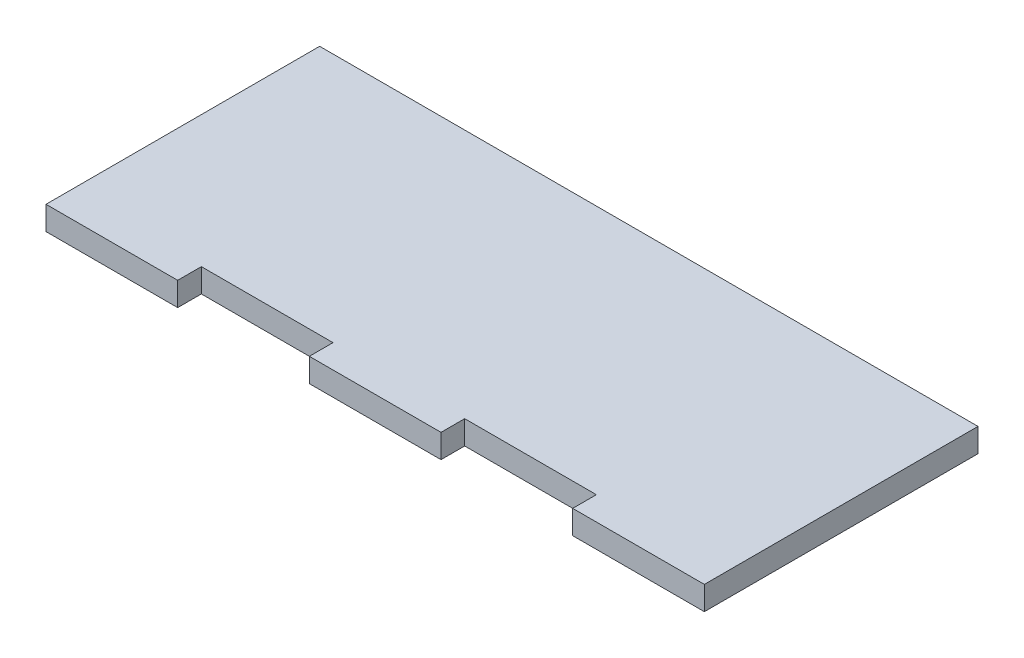
ISO-10303-21;
HEADER;
FILE_DESCRIPTION(('STEP AP214'),'2;1');
FILE_NAME('part.step','',(''),(''),'','','');
FILE_SCHEMA(('AUTOMOTIVE_DESIGN { 1 0 10303 214 1 1 1 1 }'));
ENDSEC;
DATA;
#1=APPLICATION_CONTEXT('core data for automotive mechanical design processes');
#2=APPLICATION_PROTOCOL_DEFINITION('international standard','automotive_design',2000,#1);
#3=PRODUCT_CONTEXT('',#1,'mechanical');
#4=PRODUCT('Part','Part','',(#3));
#5=PRODUCT_RELATED_PRODUCT_CATEGORY('part','',(#4));
#6=PRODUCT_DEFINITION_FORMATION('','',#4);
#7=PRODUCT_DEFINITION_CONTEXT('part definition',#1,'design');
#8=PRODUCT_DEFINITION('design','',#6,#7);
#9=PRODUCT_DEFINITION_SHAPE('','',#8);
#10=(LENGTH_UNIT() NAMED_UNIT(*) SI_UNIT(.MILLI.,.METRE.));
#11=(NAMED_UNIT(*) PLANE_ANGLE_UNIT() SI_UNIT($,.RADIAN.));
#12=(NAMED_UNIT(*) SI_UNIT($,.STERADIAN.) SOLID_ANGLE_UNIT());
#13=UNCERTAINTY_MEASURE_WITH_UNIT(LENGTH_MEASURE(1.E-05),#10,'distance_accuracy_value','');
#14=(GEOMETRIC_REPRESENTATION_CONTEXT(3) GLOBAL_UNCERTAINTY_ASSIGNED_CONTEXT((#13)) GLOBAL_UNIT_ASSIGNED_CONTEXT((#10,
#11,#12)) REPRESENTATION_CONTEXT('',''));
#15=CARTESIAN_POINT('',(0.,0.,0.));
#16=DIRECTION('',(0.,0.,1.));
#17=DIRECTION('',(1.,0.,0.));
#18=AXIS2_PLACEMENT_3D('',#15,#16,#17);
#19=CARTESIAN_POINT('',(-69.720993227991,7.2136,-3.44018058690745));
#20=DIRECTION('',(0.,0.,-1.));
#21=DIRECTION('',(-1.,0.,0.));
#22=AXIS2_PLACEMENT_3D('',#19,#20,#21);
#23=PLANE('',#22);
#24=DIRECTION('',(1.,0.,0.));
#25=VECTOR('',#24,1.);
#26=CARTESIAN_POINT('',(-69.720993227991,0.,-3.44018058690745));
#27=LINE('',#26,#25);
#28=CARTESIAN_POINT('',(-69.720993227991,0.,-3.44018058690745));
#29=VERTEX_POINT('',#28);
#30=CARTESIAN_POINT('',(-29.609313227991,0.,-3.44018058690745));
#31=VERTEX_POINT('',#30);
#32=EDGE_CURVE('E196',#29,#31,#27,.T.);
#33=ORIENTED_EDGE('',*,*,#32,.T.);
#34=DIRECTION('',(0.,-1.,0.));
#35=VECTOR('',#34,1.);
#36=CARTESIAN_POINT('',(-29.609313227991,7.2136,-3.44018058690745));
#37=LINE('',#36,#35);
#38=CARTESIAN_POINT('',(-29.609313227991,7.2136,-3.44018058690745));
#39=VERTEX_POINT('',#38);
#40=EDGE_CURVE('E152',#39,#31,#37,.T.);
#41=ORIENTED_EDGE('',*,*,#40,.F.);
#42=DIRECTION('',(1.,0.,0.));
#43=VECTOR('',#42,1.);
#44=CARTESIAN_POINT('',(-69.720993227991,7.2136,-3.44018058690745));
#45=LINE('',#44,#43);
#46=CARTESIAN_POINT('',(-69.720993227991,7.2136,-3.44018058690745));
#47=VERTEX_POINT('',#46);
#48=EDGE_CURVE('E142',#47,#39,#45,.T.);
#49=ORIENTED_EDGE('',*,*,#48,.F.);
#50=DIRECTION('',(0.,-1.,0.));
#51=VECTOR('',#50,1.);
#52=CARTESIAN_POINT('',(-69.720993227991,7.2136,-3.44018058690745));
#53=LINE('',#52,#51);
#54=EDGE_CURVE('E11',#47,#29,#53,.T.);
#55=ORIENTED_EDGE('',*,*,#54,.T.);
#56=EDGE_LOOP('',(#33,#41,#49,#55));
#57=FACE_BOUND('',#56,.T.);
#58=ADVANCED_FACE('F33',(#57),#23,.F.);
#59=CARTESIAN_POINT('',(90.7257267720089,7.2136,-3.44018058690744));
#60=VERTEX_POINT('',#59);
#61=CARTESIAN_POINT('',(130.837406772009,7.2136,-3.44018058690745));
#62=VERTEX_POINT('',#61);
#63=EDGE_CURVE('E184',#60,#62,#45,.T.);
#64=ORIENTED_EDGE('',*,*,#63,.F.);
#65=DIRECTION('',(0.,-1.,0.));
#66=VECTOR('',#65,1.);
#67=CARTESIAN_POINT('',(90.7257267720089,7.2136,-3.44018058690744));
#68=LINE('',#67,#66);
#69=CARTESIAN_POINT('',(90.7257267720089,0.,-3.44018058690744));
#70=VERTEX_POINT('',#69);
#71=EDGE_CURVE('E169',#60,#70,#68,.T.);
#72=ORIENTED_EDGE('',*,*,#71,.T.);
#73=CARTESIAN_POINT('',(130.837406772009,0.,-3.44018058690745));
#74=VERTEX_POINT('',#73);
#75=EDGE_CURVE('E195',#70,#74,#27,.T.);
#76=ORIENTED_EDGE('',*,*,#75,.T.);
#77=DIRECTION('',(0.,-1.,0.));
#78=VECTOR('',#77,1.);
#79=CARTESIAN_POINT('',(130.837406772009,7.2136,-3.44018058690745));
#80=LINE('',#79,#78);
#81=EDGE_CURVE('E41',#62,#74,#80,.T.);
#82=ORIENTED_EDGE('',*,*,#81,.F.);
#83=EDGE_LOOP('',(#64,#72,#76,#82));
#84=FACE_BOUND('',#83,.T.);
#85=ADVANCED_FACE('F237',(#84),#23,.F.);
#86=CARTESIAN_POINT('',(-69.720993227991,7.2136,-86.8029805869075));
#87=DIRECTION('',(1.,0.,0.));
#88=DIRECTION('',(0.,0.,-1.));
#89=AXIS2_PLACEMENT_3D('',#86,#87,#88);
#90=PLANE('',#89);
#91=DIRECTION('',(0.,0.,1.));
#92=VECTOR('',#91,1.);
#93=CARTESIAN_POINT('',(-69.720993227991,0.,-86.8029805869075));
#94=LINE('',#93,#92);
#95=CARTESIAN_POINT('',(-69.720993227991,0.,-86.8029805869075));
#96=VERTEX_POINT('',#95);
#97=EDGE_CURVE('E154',#96,#29,#94,.T.);
#98=ORIENTED_EDGE('',*,*,#97,.T.);
#99=ORIENTED_EDGE('',*,*,#54,.F.);
#100=DIRECTION('',(0.,0.,1.));
#101=VECTOR('',#100,1.);
#102=CARTESIAN_POINT('',(-69.720993227991,7.2136,-86.8029805869075));
#103=LINE('',#102,#101);
#104=CARTESIAN_POINT('',(-69.720993227991,7.2136,-86.8029805869075));
#105=VERTEX_POINT('',#104);
#106=EDGE_CURVE('E182',#105,#47,#103,.T.);
#107=ORIENTED_EDGE('',*,*,#106,.F.);
#108=DIRECTION('',(0.,-1.,0.));
#109=VECTOR('',#108,1.);
#110=CARTESIAN_POINT('',(-69.720993227991,7.2136,-86.8029805869075));
#111=LINE('',#110,#109);
#112=EDGE_CURVE('E192',#105,#96,#111,.T.);
#113=ORIENTED_EDGE('',*,*,#112,.T.);
#114=EDGE_LOOP('',(#98,#99,#107,#113));
#115=FACE_BOUND('',#114,.T.);
#116=ADVANCED_FACE('F35',(#115),#90,.F.);
#117=CARTESIAN_POINT('',(10.502366772009,7.2136,-3.44018058690747));
#118=VERTEX_POINT('',#117);
#119=CARTESIAN_POINT('',(50.6140467720089,7.2136,-3.44018058690747));
#120=VERTEX_POINT('',#119);
#121=EDGE_CURVE('E188',#118,#120,#45,.T.);
#122=ORIENTED_EDGE('',*,*,#121,.F.);
#123=DIRECTION('',(0.,-1.,0.));
#124=VECTOR('',#123,1.);
#125=CARTESIAN_POINT('',(10.502366772009,7.2136,-3.44018058690747));
#126=LINE('',#125,#124);
#127=CARTESIAN_POINT('',(10.502366772009,0.,-3.44018058690747));
#128=VERTEX_POINT('',#127);
#129=EDGE_CURVE('E155',#118,#128,#126,.T.);
#130=ORIENTED_EDGE('',*,*,#129,.T.);
#131=CARTESIAN_POINT('',(50.6140467720089,0.,-3.44018058690745));
#132=VERTEX_POINT('',#131);
#133=EDGE_CURVE('E200',#128,#132,#27,.T.);
#134=ORIENTED_EDGE('',*,*,#133,.T.);
#135=DIRECTION('',(0.,-1.,0.));
#136=VECTOR('',#135,1.);
#137=CARTESIAN_POINT('',(50.6140467720089,7.2136,-3.44018058690747));
#138=LINE('',#137,#136);
#139=EDGE_CURVE('E56',#120,#132,#138,.T.);
#140=ORIENTED_EDGE('',*,*,#139,.F.);
#141=EDGE_LOOP('',(#122,#130,#134,#140));
#142=FACE_BOUND('',#141,.T.);
#143=ADVANCED_FACE('F233',(#142),#23,.F.);
#144=CARTESIAN_POINT('',(130.837406772009,7.2136,-86.8029805869075));
#145=DIRECTION('',(-1.,0.,0.));
#146=DIRECTION('',(0.,0.,1.));
#147=AXIS2_PLACEMENT_3D('',#144,#145,#146);
#148=PLANE('',#147);
#149=DIRECTION('',(0.,0.,-1.));
#150=VECTOR('',#149,1.);
#151=CARTESIAN_POINT('',(130.837406772009,0.,-86.8029805869075));
#152=LINE('',#151,#150);
#153=CARTESIAN_POINT('',(130.837406772009,0.,-86.8029805869075));
#154=VERTEX_POINT('',#153);
#155=EDGE_CURVE('E199',#74,#154,#152,.T.);
#156=ORIENTED_EDGE('',*,*,#155,.T.);
#157=DIRECTION('',(0.,-1.,0.));
#158=VECTOR('',#157,1.);
#159=CARTESIAN_POINT('',(130.837406772009,7.2136,-86.8029805869075));
#160=LINE('',#159,#158);
#161=CARTESIAN_POINT('',(130.837406772009,7.2136,-86.8029805869075));
#162=VERTEX_POINT('',#161);
#163=EDGE_CURVE('E205',#162,#154,#160,.T.);
#164=ORIENTED_EDGE('',*,*,#163,.F.);
#165=DIRECTION('',(0.,0.,-1.));
#166=VECTOR('',#165,1.);
#167=CARTESIAN_POINT('',(130.837406772009,7.2136,-86.8029805869075));
#168=LINE('',#167,#166);
#169=EDGE_CURVE('E187',#62,#162,#168,.T.);
#170=ORIENTED_EDGE('',*,*,#169,.F.);
#171=ORIENTED_EDGE('',*,*,#81,.T.);
#172=EDGE_LOOP('',(#156,#164,#170,#171));
#173=FACE_BOUND('',#172,.T.);
#174=ADVANCED_FACE('F212',(#173),#148,.F.);
#175=CARTESIAN_POINT('',(-69.720993227991,7.2136,-86.8029805869075));
#176=DIRECTION('',(0.,0.,1.));
#177=DIRECTION('',(1.,0.,0.));
#178=AXIS2_PLACEMENT_3D('',#175,#176,#177);
#179=PLANE('',#178);
#180=DIRECTION('',(-1.,0.,0.));
#181=VECTOR('',#180,1.);
#182=CARTESIAN_POINT('',(-69.720993227991,0.,-86.8029805869075));
#183=LINE('',#182,#181);
#184=EDGE_CURVE('E185',#154,#96,#183,.T.);
#185=ORIENTED_EDGE('',*,*,#184,.T.);
#186=ORIENTED_EDGE('',*,*,#112,.F.);
#187=DIRECTION('',(-1.,0.,0.));
#188=VECTOR('',#187,1.);
#189=CARTESIAN_POINT('',(-69.720993227991,7.2136,-86.8029805869075));
#190=LINE('',#189,#188);
#191=EDGE_CURVE('E190',#162,#105,#190,.T.);
#192=ORIENTED_EDGE('',*,*,#191,.F.);
#193=ORIENTED_EDGE('',*,*,#163,.T.);
#194=EDGE_LOOP('',(#185,#186,#192,#193));
#195=FACE_BOUND('',#194,.T.);
#196=ADVANCED_FACE('F224',(#195),#179,.F.);
#197=CARTESIAN_POINT('',(0.,7.2136,0.));
#198=DIRECTION('',(0.,1.,0.));
#199=DIRECTION('',(0.,0.,1.));
#200=AXIS2_PLACEMENT_3D('',#197,#198,#199);
#201=PLANE('',#200);
#202=DIRECTION('',(0.,0.,-1.));
#203=VECTOR('',#202,1.);
#204=CARTESIAN_POINT('',(-29.609313227991,7.2136,-3.44018058690745));
#205=LINE('',#204,#203);
#206=CARTESIAN_POINT('',(-29.609313227991,7.2136,-10.6537805869075));
#207=VERTEX_POINT('',#206);
#208=EDGE_CURVE('E124',#39,#207,#205,.T.);
#209=ORIENTED_EDGE('',*,*,#208,.T.);
#210=DIRECTION('',(1.,0.,0.));
#211=VECTOR('',#210,1.);
#212=CARTESIAN_POINT('',(-29.609313227991,7.2136,-10.6537805869075));
#213=LINE('',#212,#211);
#214=CARTESIAN_POINT('',(10.502366772009,7.2136,-10.6537805869075));
#215=VERTEX_POINT('',#214);
#216=EDGE_CURVE('E133',#207,#215,#213,.T.);
#217=ORIENTED_EDGE('',*,*,#216,.T.);
#218=DIRECTION('',(0.,0.,1.));
#219=VECTOR('',#218,1.);
#220=CARTESIAN_POINT('',(10.502366772009,7.2136,-3.44018058690747));
#221=LINE('',#220,#219);
#222=EDGE_CURVE('E130',#215,#118,#221,.T.);
#223=ORIENTED_EDGE('',*,*,#222,.T.);
#224=ORIENTED_EDGE('',*,*,#121,.T.);
#225=DIRECTION('',(0.,0.,-1.));
#226=VECTOR('',#225,1.);
#227=CARTESIAN_POINT('',(50.6140467720089,7.2136,-3.44018058690747));
#228=LINE('',#227,#226);
#229=CARTESIAN_POINT('',(50.6140467720089,7.2136,-10.6537805869075));
#230=VERTEX_POINT('',#229);
#231=EDGE_CURVE('E162',#120,#230,#228,.T.);
#232=ORIENTED_EDGE('',*,*,#231,.T.);
#233=DIRECTION('',(1.,0.,0.));
#234=VECTOR('',#233,1.);
#235=CARTESIAN_POINT('',(90.7257267720089,7.2136,-10.6537805869074));
#236=LINE('',#235,#234);
#237=CARTESIAN_POINT('',(90.7257267720089,7.2136,-10.6537805869074));
#238=VERTEX_POINT('',#237);
#239=EDGE_CURVE('E166',#230,#238,#236,.T.);
#240=ORIENTED_EDGE('',*,*,#239,.T.);
#241=DIRECTION('',(0.,0.,1.));
#242=VECTOR('',#241,1.);
#243=CARTESIAN_POINT('',(90.7257267720089,7.2136,-3.44018058690744));
#244=LINE('',#243,#242);
#245=EDGE_CURVE('E159',#238,#60,#244,.T.);
#246=ORIENTED_EDGE('',*,*,#245,.T.);
#247=ORIENTED_EDGE('',*,*,#63,.T.);
#248=ORIENTED_EDGE('',*,*,#169,.T.);
#249=ORIENTED_EDGE('',*,*,#191,.T.);
#250=ORIENTED_EDGE('',*,*,#106,.T.);
#251=ORIENTED_EDGE('',*,*,#48,.T.);
#252=EDGE_LOOP('',(#209,#217,#223,#224,#232,#240,#246,#247,#248,#249,#250,#251));
#253=FACE_BOUND('',#252,.T.);
#254=ADVANCED_FACE('F140',(#253),#201,.T.);
#255=CARTESIAN_POINT('',(0.,0.,0.));
#256=DIRECTION('',(0.,1.,0.));
#257=DIRECTION('',(0.,0.,1.));
#258=AXIS2_PLACEMENT_3D('',#255,#256,#257);
#259=PLANE('',#258);
#260=DIRECTION('',(1.,0.,0.));
#261=VECTOR('',#260,1.);
#262=CARTESIAN_POINT('',(-29.609313227991,0.,-10.6537805869075));
#263=LINE('',#262,#261);
#264=CARTESIAN_POINT('',(-29.609313227991,0.,-10.6537805869075));
#265=VERTEX_POINT('',#264);
#266=CARTESIAN_POINT('',(10.502366772009,0.,-10.6537805869075));
#267=VERTEX_POINT('',#266);
#268=EDGE_CURVE('E145',#265,#267,#263,.T.);
#269=ORIENTED_EDGE('',*,*,#268,.F.);
#270=DIRECTION('',(0.,0.,-1.));
#271=VECTOR('',#270,1.);
#272=CARTESIAN_POINT('',(-29.609313227991,0.,-3.44018058690745));
#273=LINE('',#272,#271);
#274=EDGE_CURVE('E48',#31,#265,#273,.T.);
#275=ORIENTED_EDGE('',*,*,#274,.F.);
#276=ORIENTED_EDGE('',*,*,#32,.F.);
#277=ORIENTED_EDGE('',*,*,#97,.F.);
#278=ORIENTED_EDGE('',*,*,#184,.F.);
#279=ORIENTED_EDGE('',*,*,#155,.F.);
#280=ORIENTED_EDGE('',*,*,#75,.F.);
#281=DIRECTION('',(0.,0.,1.));
#282=VECTOR('',#281,1.);
#283=CARTESIAN_POINT('',(90.7257267720089,0.,-3.44018058690744));
#284=LINE('',#283,#282);
#285=CARTESIAN_POINT('',(90.7257267720089,0.,-10.6537805869074));
#286=VERTEX_POINT('',#285);
#287=EDGE_CURVE('E170',#286,#70,#284,.T.);
#288=ORIENTED_EDGE('',*,*,#287,.F.);
#289=DIRECTION('',(1.,0.,0.));
#290=VECTOR('',#289,1.);
#291=CARTESIAN_POINT('',(90.7257267720089,0.,-10.6537805869074));
#292=LINE('',#291,#290);
#293=CARTESIAN_POINT('',(50.6140467720089,0.,-10.6537805869075));
#294=VERTEX_POINT('',#293);
#295=EDGE_CURVE('E163',#294,#286,#292,.T.);
#296=ORIENTED_EDGE('',*,*,#295,.F.);
#297=DIRECTION('',(0.,0.,-1.));
#298=VECTOR('',#297,1.);
#299=CARTESIAN_POINT('',(50.6140467720089,0.,-3.44018058690747));
#300=LINE('',#299,#298);
#301=EDGE_CURVE('E172',#132,#294,#300,.T.);
#302=ORIENTED_EDGE('',*,*,#301,.F.);
#303=ORIENTED_EDGE('',*,*,#133,.F.);
#304=DIRECTION('',(0.,0.,1.));
#305=VECTOR('',#304,1.);
#306=CARTESIAN_POINT('',(10.502366772009,0.,-3.44018058690747));
#307=LINE('',#306,#305);
#308=EDGE_CURVE('E143',#267,#128,#307,.T.);
#309=ORIENTED_EDGE('',*,*,#308,.F.);
#310=EDGE_LOOP('',(#269,#275,#276,#277,#278,#279,#280,#288,#296,#302,#303,#309));
#311=FACE_BOUND('',#310,.T.);
#312=ADVANCED_FACE('F219',(#311),#259,.F.);
#313=CARTESIAN_POINT('',(90.7257267720089,7.2136,-3.44018058690744));
#314=DIRECTION('',(1.,0.,0.));
#315=DIRECTION('',(0.,0.,-1.));
#316=AXIS2_PLACEMENT_3D('',#313,#314,#315);
#317=PLANE('',#316);
#318=ORIENTED_EDGE('',*,*,#287,.T.);
#319=ORIENTED_EDGE('',*,*,#71,.F.);
#320=ORIENTED_EDGE('',*,*,#245,.F.);
#321=DIRECTION('',(0.,-1.,0.));
#322=VECTOR('',#321,1.);
#323=CARTESIAN_POINT('',(90.7257267720089,7.2136,-10.6537805869074));
#324=LINE('',#323,#322);
#325=EDGE_CURVE('E150',#238,#286,#324,.T.);
#326=ORIENTED_EDGE('',*,*,#325,.T.);
#327=EDGE_LOOP('',(#318,#319,#320,#326));
#328=FACE_BOUND('',#327,.T.);
#329=ADVANCED_FACE('F239',(#328),#317,.F.);
#330=CARTESIAN_POINT('',(90.7257267720089,7.2136,-10.6537805869074));
#331=DIRECTION('',(0.,0.,-1.));
#332=DIRECTION('',(-1.,0.,0.));
#333=AXIS2_PLACEMENT_3D('',#330,#331,#332);
#334=PLANE('',#333);
#335=ORIENTED_EDGE('',*,*,#295,.T.);
#336=ORIENTED_EDGE('',*,*,#325,.F.);
#337=ORIENTED_EDGE('',*,*,#239,.F.);
#338=DIRECTION('',(0.,-1.,0.));
#339=VECTOR('',#338,1.);
#340=CARTESIAN_POINT('',(50.6140467720089,7.2136,-10.6537805869075));
#341=LINE('',#340,#339);
#342=EDGE_CURVE('E177',#230,#294,#341,.T.);
#343=ORIENTED_EDGE('',*,*,#342,.T.);
#344=EDGE_LOOP('',(#335,#336,#337,#343));
#345=FACE_BOUND('',#344,.T.);
#346=ADVANCED_FACE('F242',(#345),#334,.F.);
#347=CARTESIAN_POINT('',(50.6140467720089,7.2136,-3.44018058690747));
#348=DIRECTION('',(-1.,0.,0.));
#349=DIRECTION('',(0.,0.,1.));
#350=AXIS2_PLACEMENT_3D('',#347,#348,#349);
#351=PLANE('',#350);
#352=ORIENTED_EDGE('',*,*,#301,.T.);
#353=ORIENTED_EDGE('',*,*,#342,.F.);
#354=ORIENTED_EDGE('',*,*,#231,.F.);
#355=ORIENTED_EDGE('',*,*,#139,.T.);
#356=EDGE_LOOP('',(#352,#353,#354,#355));
#357=FACE_BOUND('',#356,.T.);
#358=ADVANCED_FACE('F244',(#357),#351,.F.);
#359=CARTESIAN_POINT('',(-29.609313227991,7.2136,-3.44018058690745));
#360=DIRECTION('',(-1.,0.,0.));
#361=DIRECTION('',(0.,0.,1.));
#362=AXIS2_PLACEMENT_3D('',#359,#360,#361);
#363=PLANE('',#362);
#364=ORIENTED_EDGE('',*,*,#274,.T.);
#365=DIRECTION('',(0.,-1.,0.));
#366=VECTOR('',#365,1.);
#367=CARTESIAN_POINT('',(-29.609313227991,7.2136,-10.6537805869075));
#368=LINE('',#367,#366);
#369=EDGE_CURVE('E120',#207,#265,#368,.T.);
#370=ORIENTED_EDGE('',*,*,#369,.F.);
#371=ORIENTED_EDGE('',*,*,#208,.F.);
#372=ORIENTED_EDGE('',*,*,#40,.T.);
#373=EDGE_LOOP('',(#364,#370,#371,#372));
#374=FACE_BOUND('',#373,.T.);
#375=ADVANCED_FACE('F122',(#374),#363,.F.);
#376=CARTESIAN_POINT('',(10.502366772009,7.2136,-3.44018058690747));
#377=DIRECTION('',(1.,0.,0.));
#378=DIRECTION('',(0.,0.,-1.));
#379=AXIS2_PLACEMENT_3D('',#376,#377,#378);
#380=PLANE('',#379);
#381=ORIENTED_EDGE('',*,*,#308,.T.);
#382=ORIENTED_EDGE('',*,*,#129,.F.);
#383=ORIENTED_EDGE('',*,*,#222,.F.);
#384=DIRECTION('',(0.,-1.,0.));
#385=VECTOR('',#384,1.);
#386=CARTESIAN_POINT('',(10.502366772009,7.2136,-10.6537805869075));
#387=LINE('',#386,#385);
#388=EDGE_CURVE('E129',#215,#267,#387,.T.);
#389=ORIENTED_EDGE('',*,*,#388,.T.);
#390=EDGE_LOOP('',(#381,#382,#383,#389));
#391=FACE_BOUND('',#390,.T.);
#392=ADVANCED_FACE('F251',(#391),#380,.F.);
#393=CARTESIAN_POINT('',(-29.609313227991,7.2136,-10.6537805869075));
#394=DIRECTION('',(0.,0.,-1.));
#395=DIRECTION('',(-1.,0.,0.));
#396=AXIS2_PLACEMENT_3D('',#393,#394,#395);
#397=PLANE('',#396);
#398=ORIENTED_EDGE('',*,*,#268,.T.);
#399=ORIENTED_EDGE('',*,*,#388,.F.);
#400=ORIENTED_EDGE('',*,*,#216,.F.);
#401=ORIENTED_EDGE('',*,*,#369,.T.);
#402=EDGE_LOOP('',(#398,#399,#400,#401));
#403=FACE_BOUND('',#402,.T.);
#404=ADVANCED_FACE('F134',(#403),#397,.F.);
#405=CLOSED_SHELL('',(#58,#85,#116,#143,#174,#196,#254,#312,#329,#346,#358,#375,#392,#404));
#406=MANIFOLD_SOLID_BREP('B2',#405);
#407=ADVANCED_BREP_SHAPE_REPRESENTATION('',(#18,#406),#14);
#408=SHAPE_DEFINITION_REPRESENTATION(#9,#407);
ENDSEC;
END-ISO-10303-21;
